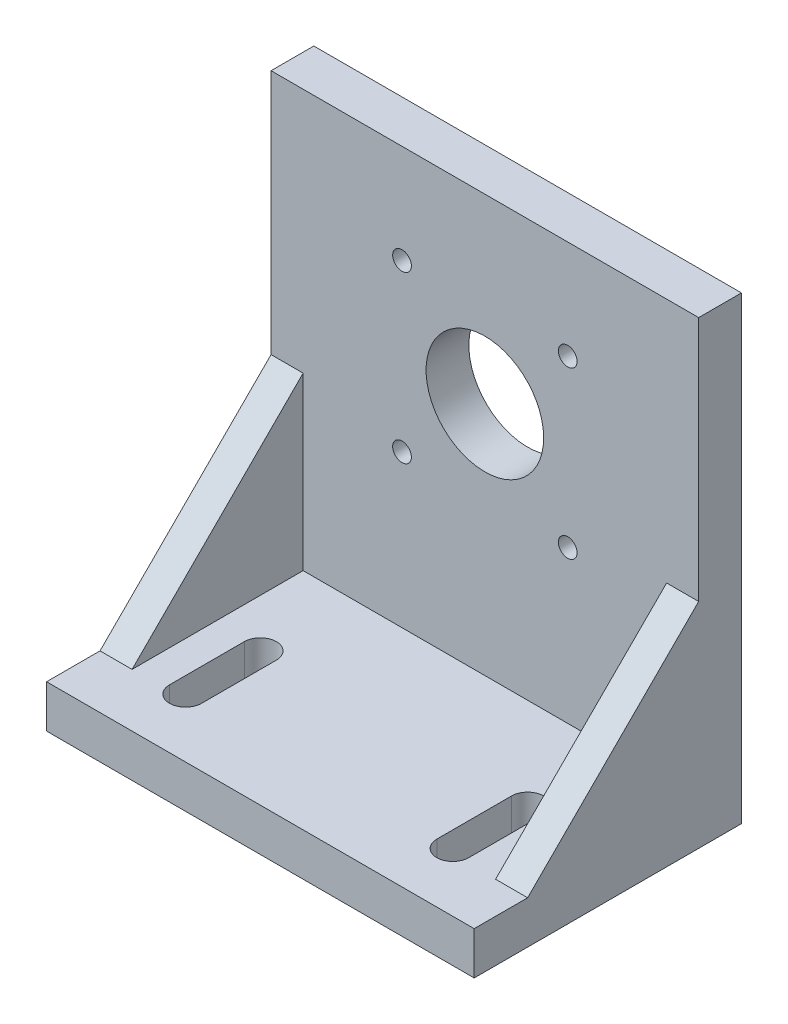
ISO-10303-21;
HEADER;
FILE_DESCRIPTION(('STEP AP214'),'2;1');
FILE_NAME('part.step','',(''),(''),'','','');
FILE_SCHEMA(('AUTOMOTIVE_DESIGN { 1 0 10303 214 1 1 1 1 }'));
ENDSEC;
DATA;
#1=APPLICATION_CONTEXT('core data for automotive mechanical design processes');
#2=APPLICATION_PROTOCOL_DEFINITION('international standard','automotive_design',2000,#1);
#3=PRODUCT_CONTEXT('',#1,'mechanical');
#4=PRODUCT('Part','Part','',(#3));
#5=PRODUCT_RELATED_PRODUCT_CATEGORY('part','',(#4));
#6=PRODUCT_DEFINITION_FORMATION('','',#4);
#7=PRODUCT_DEFINITION_CONTEXT('part definition',#1,'design');
#8=PRODUCT_DEFINITION('design','',#6,#7);
#9=PRODUCT_DEFINITION_SHAPE('','',#8);
#10=(LENGTH_UNIT() NAMED_UNIT(*) SI_UNIT(.MILLI.,.METRE.));
#11=(NAMED_UNIT(*) PLANE_ANGLE_UNIT() SI_UNIT($,.RADIAN.));
#12=(NAMED_UNIT(*) SI_UNIT($,.STERADIAN.) SOLID_ANGLE_UNIT());
#13=UNCERTAINTY_MEASURE_WITH_UNIT(LENGTH_MEASURE(1.E-05),#10,'distance_accuracy_value','');
#14=(GEOMETRIC_REPRESENTATION_CONTEXT(3) GLOBAL_UNCERTAINTY_ASSIGNED_CONTEXT((#13)) GLOBAL_UNIT_ASSIGNED_CONTEXT((#10,
#11,#12)) REPRESENTATION_CONTEXT('',''));
#15=CARTESIAN_POINT('',(0.,0.,0.));
#16=DIRECTION('',(0.,0.,1.));
#17=DIRECTION('',(1.,0.,0.));
#18=AXIS2_PLACEMENT_3D('',#15,#16,#17);
#19=CARTESIAN_POINT('',(0.,8.,0.));
#20=DIRECTION('',(0.,-1.,0.));
#21=DIRECTION('',(0.,0.,-1.));
#22=AXIS2_PLACEMENT_3D('',#19,#20,#21);
#23=PLANE('',#22);
#24=DIRECTION('',(0.,0.,-1.));
#25=VECTOR('',#24,1.);
#26=CARTESIAN_POINT('',(-28.,8.,0.));
#27=LINE('',#26,#25);
#28=CARTESIAN_POINT('',(-28.,8.00000000000001,31.));
#29=VERTEX_POINT('',#28);
#30=CARTESIAN_POINT('',(-28.,8.,17.));
#31=VERTEX_POINT('',#30);
#32=EDGE_CURVE('E281',#29,#31,#27,.T.);
#33=ORIENTED_EDGE('',*,*,#32,.T.);
#34=CARTESIAN_POINT('',(-25.,8.00000000000001,17.));
#35=DIRECTION('',(0.,-1.,0.));
#36=DIRECTION('',(0.,0.,-1.));
#37=AXIS2_PLACEMENT_3D('',#34,#35,#36);
#38=CIRCLE('',#37,3.);
#39=CARTESIAN_POINT('',(-22.,8.00000000000001,17.));
#40=VERTEX_POINT('',#39);
#41=EDGE_CURVE('E252',#31,#40,#38,.T.);
#42=ORIENTED_EDGE('',*,*,#41,.T.);
#43=DIRECTION('',(0.,0.,1.));
#44=VECTOR('',#43,1.);
#45=CARTESIAN_POINT('',(-22.,8.,0.));
#46=LINE('',#45,#44);
#47=CARTESIAN_POINT('',(-22.,8.00000000000001,31.));
#48=VERTEX_POINT('',#47);
#49=EDGE_CURVE('E286',#40,#48,#46,.T.);
#50=ORIENTED_EDGE('',*,*,#49,.T.);
#51=CARTESIAN_POINT('',(-25.,8.00000000000001,31.));
#52=DIRECTION('',(0.,-1.,0.));
#53=DIRECTION('',(0.,0.,-1.));
#54=AXIS2_PLACEMENT_3D('',#51,#52,#53);
#55=CIRCLE('',#54,3.);
#56=EDGE_CURVE('E241',#48,#29,#55,.T.);
#57=ORIENTED_EDGE('',*,*,#56,.T.);
#58=EDGE_LOOP('',(#33,#42,#50,#57));
#59=FACE_BOUND('',#58,.T.);
#60=DIRECTION('',(0.,0.,-1.));
#61=VECTOR('',#60,1.);
#62=CARTESIAN_POINT('',(22.,8.,0.));
#63=LINE('',#62,#61);
#64=CARTESIAN_POINT('',(22.,8.00000000000001,31.));
#65=VERTEX_POINT('',#64);
#66=CARTESIAN_POINT('',(22.,8.,17.));
#67=VERTEX_POINT('',#66);
#68=EDGE_CURVE('E269',#65,#67,#63,.T.);
#69=ORIENTED_EDGE('',*,*,#68,.T.);
#70=CARTESIAN_POINT('',(25.,8.00000000000001,17.));
#71=DIRECTION('',(0.,-1.,0.));
#72=DIRECTION('',(0.,0.,-1.));
#73=AXIS2_PLACEMENT_3D('',#70,#71,#72);
#74=CIRCLE('',#73,3.);
#75=CARTESIAN_POINT('',(28.,8.00000000000001,17.));
#76=VERTEX_POINT('',#75);
#77=EDGE_CURVE('E197',#67,#76,#74,.T.);
#78=ORIENTED_EDGE('',*,*,#77,.T.);
#79=DIRECTION('',(0.,0.,1.));
#80=VECTOR('',#79,1.);
#81=CARTESIAN_POINT('',(28.,8.,0.));
#82=LINE('',#81,#80);
#83=CARTESIAN_POINT('',(28.,8.00000000000001,31.));
#84=VERTEX_POINT('',#83);
#85=EDGE_CURVE('E275',#76,#84,#82,.T.);
#86=ORIENTED_EDGE('',*,*,#85,.T.);
#87=CARTESIAN_POINT('',(25.,8.00000000000001,31.));
#88=DIRECTION('',(0.,-1.,0.));
#89=DIRECTION('',(0.,0.,-1.));
#90=AXIS2_PLACEMENT_3D('',#87,#88,#89);
#91=CIRCLE('',#90,3.);
#92=EDGE_CURVE('E272',#84,#65,#91,.T.);
#93=ORIENTED_EDGE('',*,*,#92,.T.);
#94=EDGE_LOOP('',(#69,#78,#86,#93));
#95=FACE_BOUND('',#94,.T.);
#96=DIRECTION('',(-1.,0.,0.));
#97=VECTOR('',#96,1.);
#98=CARTESIAN_POINT('',(40.,8.,32.));
#99=LINE('',#98,#97);
#100=CARTESIAN_POINT('',(40.,8.,32.));
#101=VERTEX_POINT('',#100);
#102=CARTESIAN_POINT('',(34.,8.,32.));
#103=VERTEX_POINT('',#102);
#104=EDGE_CURVE('E67',#101,#103,#99,.T.);
#105=ORIENTED_EDGE('',*,*,#104,.T.);
#106=DIRECTION('',(0.,0.,-1.));
#107=VECTOR('',#106,1.);
#108=CARTESIAN_POINT('',(34.,8.,0.));
#109=LINE('',#108,#107);
#110=CARTESIAN_POINT('',(34.,8.,0.));
#111=VERTEX_POINT('',#110);
#112=EDGE_CURVE('E463',#103,#111,#109,.T.);
#113=ORIENTED_EDGE('',*,*,#112,.T.);
#114=DIRECTION('',(1.,0.,0.));
#115=VECTOR('',#114,1.);
#116=CARTESIAN_POINT('',(-40.,8.,0.));
#117=LINE('',#116,#115);
#118=CARTESIAN_POINT('',(-34.,8.,0.));
#119=VERTEX_POINT('',#118);
#120=EDGE_CURVE('E305',#119,#111,#117,.T.);
#121=ORIENTED_EDGE('',*,*,#120,.F.);
#122=DIRECTION('',(0.,0.,-1.));
#123=VECTOR('',#122,1.);
#124=CARTESIAN_POINT('',(-34.,8.,0.));
#125=LINE('',#124,#123);
#126=CARTESIAN_POINT('',(-34.,8.,32.));
#127=VERTEX_POINT('',#126);
#128=EDGE_CURVE('E425',#127,#119,#125,.T.);
#129=ORIENTED_EDGE('',*,*,#128,.F.);
#130=DIRECTION('',(-1.,0.,0.));
#131=VECTOR('',#130,1.);
#132=CARTESIAN_POINT('',(-34.,8.,32.));
#133=LINE('',#132,#131);
#134=CARTESIAN_POINT('',(-40.,8.,32.));
#135=VERTEX_POINT('',#134);
#136=EDGE_CURVE('E418',#127,#135,#133,.T.);
#137=ORIENTED_EDGE('',*,*,#136,.T.);
#138=DIRECTION('',(0.,0.,1.));
#139=VECTOR('',#138,1.);
#140=CARTESIAN_POINT('',(-40.,8.,42.));
#141=LINE('',#140,#139);
#142=CARTESIAN_POINT('',(-40.,8.,42.));
#143=VERTEX_POINT('',#142);
#144=EDGE_CURVE('E311',#135,#143,#141,.T.);
#145=ORIENTED_EDGE('',*,*,#144,.T.);
#146=DIRECTION('',(1.,0.,0.));
#147=VECTOR('',#146,1.);
#148=CARTESIAN_POINT('',(40.,8.,42.));
#149=LINE('',#148,#147);
#150=CARTESIAN_POINT('',(40.,8.,42.));
#151=VERTEX_POINT('',#150);
#152=EDGE_CURVE('E314',#143,#151,#149,.T.);
#153=ORIENTED_EDGE('',*,*,#152,.T.);
#154=DIRECTION('',(0.,0.,-1.));
#155=VECTOR('',#154,1.);
#156=CARTESIAN_POINT('',(40.,8.,-8.));
#157=LINE('',#156,#155);
#158=EDGE_CURVE('E318',#151,#101,#157,.T.);
#159=ORIENTED_EDGE('',*,*,#158,.T.);
#160=EDGE_LOOP('',(#105,#113,#121,#129,#137,#145,#153,#159));
#161=FACE_BOUND('',#160,.T.);
#162=ADVANCED_FACE('F51',(#59,#95,#161),#23,.F.);
#163=CARTESIAN_POINT('',(0.,0.,0.));
#164=DIRECTION('',(0.,0.,1.));
#165=DIRECTION('',(1.,0.,0.));
#166=AXIS2_PLACEMENT_3D('',#163,#164,#165);
#167=PLANE('',#166);
#168=CARTESIAN_POINT('',(15.5,67.5,0.));
#169=DIRECTION('',(0.,0.,1.));
#170=DIRECTION('',(1.,0.,0.));
#171=AXIS2_PLACEMENT_3D('',#168,#169,#170);
#172=CIRCLE('',#171,1.75);
#173=CARTESIAN_POINT('',(17.25,67.5,0.));
#174=VERTEX_POINT('',#173);
#175=EDGE_CURVE('E432',#174,#174,#172,.T.);
#176=ORIENTED_EDGE('',*,*,#175,.F.);
#177=EDGE_LOOP('',(#176));
#178=FACE_BOUND('',#177,.T.);
#179=CARTESIAN_POINT('',(-15.5,36.5,0.));
#180=DIRECTION('',(0.,0.,1.));
#181=DIRECTION('',(1.,0.,0.));
#182=AXIS2_PLACEMENT_3D('',#179,#180,#181);
#183=CIRCLE('',#182,1.75);
#184=CARTESIAN_POINT('',(-13.75,36.5,0.));
#185=VERTEX_POINT('',#184);
#186=EDGE_CURVE('E440',#185,#185,#183,.T.);
#187=ORIENTED_EDGE('',*,*,#186,.F.);
#188=EDGE_LOOP('',(#187));
#189=FACE_BOUND('',#188,.T.);
#190=CARTESIAN_POINT('',(15.5,36.5,0.));
#191=DIRECTION('',(0.,0.,1.));
#192=DIRECTION('',(1.,0.,0.));
#193=AXIS2_PLACEMENT_3D('',#190,#191,#192);
#194=CIRCLE('',#193,1.75);
#195=CARTESIAN_POINT('',(17.25,36.5,0.));
#196=VERTEX_POINT('',#195);
#197=EDGE_CURVE('E422',#196,#196,#194,.T.);
#198=ORIENTED_EDGE('',*,*,#197,.F.);
#199=EDGE_LOOP('',(#198));
#200=FACE_BOUND('',#199,.T.);
#201=CARTESIAN_POINT('',(-15.5,67.5,0.));
#202=DIRECTION('',(0.,0.,1.));
#203=DIRECTION('',(1.,0.,0.));
#204=AXIS2_PLACEMENT_3D('',#201,#202,#203);
#205=CIRCLE('',#204,1.75);
#206=CARTESIAN_POINT('',(-13.75,67.5,0.));
#207=VERTEX_POINT('',#206);
#208=EDGE_CURVE('E436',#207,#207,#205,.T.);
#209=ORIENTED_EDGE('',*,*,#208,.F.);
#210=EDGE_LOOP('',(#209));
#211=FACE_BOUND('',#210,.T.);
#212=CARTESIAN_POINT('',(0.,52.,0.));
#213=DIRECTION('',(0.,0.,1.));
#214=DIRECTION('',(1.,0.,0.));
#215=AXIS2_PLACEMENT_3D('',#212,#213,#214);
#216=CIRCLE('',#215,11.);
#217=CARTESIAN_POINT('',(11.,52.,0.));
#218=VERTEX_POINT('',#217);
#219=EDGE_CURVE('E451',#218,#218,#216,.T.);
#220=ORIENTED_EDGE('',*,*,#219,.F.);
#221=EDGE_LOOP('',(#220));
#222=FACE_BOUND('',#221,.T.);
#223=DIRECTION('',(0.,1.,0.));
#224=VECTOR('',#223,1.);
#225=CARTESIAN_POINT('',(34.,40.,0.));
#226=LINE('',#225,#224);
#227=CARTESIAN_POINT('',(34.,40.,0.));
#228=VERTEX_POINT('',#227);
#229=EDGE_CURVE('E75',#111,#228,#226,.T.);
#230=ORIENTED_EDGE('',*,*,#229,.T.);
#231=DIRECTION('',(-1.,0.,0.));
#232=VECTOR('',#231,1.);
#233=CARTESIAN_POINT('',(40.,40.,0.));
#234=LINE('',#233,#232);
#235=CARTESIAN_POINT('',(40.,40.,0.));
#236=VERTEX_POINT('',#235);
#237=EDGE_CURVE('E408',#236,#228,#234,.T.);
#238=ORIENTED_EDGE('',*,*,#237,.F.);
#239=DIRECTION('',(0.,1.,0.));
#240=VECTOR('',#239,1.);
#241=CARTESIAN_POINT('',(40.,8.,0.));
#242=LINE('',#241,#240);
#243=CARTESIAN_POINT('',(40.,86.,0.));
#244=VERTEX_POINT('',#243);
#245=EDGE_CURVE('E307',#236,#244,#242,.T.);
#246=ORIENTED_EDGE('',*,*,#245,.T.);
#247=DIRECTION('',(1.,0.,0.));
#248=VECTOR('',#247,1.);
#249=CARTESIAN_POINT('',(0.,86.,0.));
#250=LINE('',#249,#248);
#251=CARTESIAN_POINT('',(-40.,86.,0.));
#252=VERTEX_POINT('',#251);
#253=EDGE_CURVE('E189',#252,#244,#250,.T.);
#254=ORIENTED_EDGE('',*,*,#253,.F.);
#255=DIRECTION('',(0.,-1.,0.));
#256=VECTOR('',#255,1.);
#257=CARTESIAN_POINT('',(-40.,94.,0.));
#258=LINE('',#257,#256);
#259=CARTESIAN_POINT('',(-40.,40.,0.));
#260=VERTEX_POINT('',#259);
#261=EDGE_CURVE('E302',#252,#260,#258,.T.);
#262=ORIENTED_EDGE('',*,*,#261,.T.);
#263=DIRECTION('',(-1.,0.,0.));
#264=VECTOR('',#263,1.);
#265=CARTESIAN_POINT('',(-34.,40.,0.));
#266=LINE('',#265,#264);
#267=CARTESIAN_POINT('',(-34.,40.,0.));
#268=VERTEX_POINT('',#267);
#269=EDGE_CURVE('E411',#268,#260,#266,.T.);
#270=ORIENTED_EDGE('',*,*,#269,.F.);
#271=DIRECTION('',(0.,1.,0.));
#272=VECTOR('',#271,1.);
#273=CARTESIAN_POINT('',(-34.,40.,0.));
#274=LINE('',#273,#272);
#275=EDGE_CURVE('E407',#119,#268,#274,.T.);
#276=ORIENTED_EDGE('',*,*,#275,.F.);
#277=ORIENTED_EDGE('',*,*,#120,.T.);
#278=EDGE_LOOP('',(#230,#238,#246,#254,#262,#270,#276,#277));
#279=FACE_BOUND('',#278,.T.);
#280=ADVANCED_FACE('F358',(#178,#189,#200,#211,#222,#279),#167,.T.);
#281=CARTESIAN_POINT('',(-40.,8.,42.));
#282=DIRECTION('',(1.,0.,0.));
#283=DIRECTION('',(0.,0.,-1.));
#284=AXIS2_PLACEMENT_3D('',#281,#282,#283);
#285=PLANE('',#284);
#286=ORIENTED_EDGE('',*,*,#144,.F.);
#287=DIRECTION('',(0.,-0.707106781186548,0.707106781186548));
#288=VECTOR('',#287,1.);
#289=CARTESIAN_POINT('',(-40.,8.,32.));
#290=LINE('',#289,#288);
#291=EDGE_CURVE('E402',#260,#135,#290,.T.);
#292=ORIENTED_EDGE('',*,*,#291,.F.);
#293=ORIENTED_EDGE('',*,*,#261,.F.);
#294=DIRECTION('',(0.,0.,-1.));
#295=VECTOR('',#294,1.);
#296=CARTESIAN_POINT('',(-40.,86.,42.));
#297=LINE('',#296,#295);
#298=CARTESIAN_POINT('',(-40.,86.,-8.));
#299=VERTEX_POINT('',#298);
#300=EDGE_CURVE('E294',#252,#299,#297,.T.);
#301=ORIENTED_EDGE('',*,*,#300,.T.);
#302=DIRECTION('',(0.,-1.,0.));
#303=VECTOR('',#302,1.);
#304=CARTESIAN_POINT('',(-40.,8.,-8.));
#305=LINE('',#304,#303);
#306=CARTESIAN_POINT('',(-40.,0.,-8.));
#307=VERTEX_POINT('',#306);
#308=EDGE_CURVE('E321',#299,#307,#305,.T.);
#309=ORIENTED_EDGE('',*,*,#308,.T.);
#310=DIRECTION('',(0.,0.,1.));
#311=VECTOR('',#310,1.);
#312=CARTESIAN_POINT('',(-40.,0.,42.));
#313=LINE('',#312,#311);
#314=CARTESIAN_POINT('',(-40.,0.,42.));
#315=VERTEX_POINT('',#314);
#316=EDGE_CURVE('E310',#307,#315,#313,.T.);
#317=ORIENTED_EDGE('',*,*,#316,.T.);
#318=DIRECTION('',(0.,-1.,0.));
#319=VECTOR('',#318,1.);
#320=CARTESIAN_POINT('',(-40.,8.,42.));
#321=LINE('',#320,#319);
#322=EDGE_CURVE('E344',#143,#315,#321,.T.);
#323=ORIENTED_EDGE('',*,*,#322,.F.);
#324=EDGE_LOOP('',(#286,#292,#293,#301,#309,#317,#323));
#325=FACE_BOUND('',#324,.T.);
#326=ADVANCED_FACE('F53',(#325),#285,.F.);
#327=CARTESIAN_POINT('',(40.,8.,42.));
#328=DIRECTION('',(0.,0.,-1.));
#329=DIRECTION('',(-1.,0.,0.));
#330=AXIS2_PLACEMENT_3D('',#327,#328,#329);
#331=PLANE('',#330);
#332=DIRECTION('',(1.,0.,0.));
#333=VECTOR('',#332,1.);
#334=CARTESIAN_POINT('',(40.,0.,42.));
#335=LINE('',#334,#333);
#336=CARTESIAN_POINT('',(40.,0.,42.));
#337=VERTEX_POINT('',#336);
#338=EDGE_CURVE('E325',#315,#337,#335,.T.);
#339=ORIENTED_EDGE('',*,*,#338,.T.);
#340=DIRECTION('',(0.,-1.,0.));
#341=VECTOR('',#340,1.);
#342=CARTESIAN_POINT('',(40.,8.,42.));
#343=LINE('',#342,#341);
#344=EDGE_CURVE('E340',#151,#337,#343,.T.);
#345=ORIENTED_EDGE('',*,*,#344,.F.);
#346=ORIENTED_EDGE('',*,*,#152,.F.);
#347=ORIENTED_EDGE('',*,*,#322,.T.);
#348=EDGE_LOOP('',(#339,#345,#346,#347));
#349=FACE_BOUND('',#348,.T.);
#350=ADVANCED_FACE('F376',(#349),#331,.F.);
#351=CARTESIAN_POINT('',(40.,8.,-8.));
#352=DIRECTION('',(-1.,0.,0.));
#353=DIRECTION('',(0.,0.,1.));
#354=AXIS2_PLACEMENT_3D('',#351,#352,#353);
#355=PLANE('',#354);
#356=ORIENTED_EDGE('',*,*,#245,.F.);
#357=DIRECTION('',(0.,-0.707106781186548,0.707106781186548));
#358=VECTOR('',#357,1.);
#359=CARTESIAN_POINT('',(40.,8.,32.));
#360=LINE('',#359,#358);
#361=EDGE_CURVE('E464',#236,#101,#360,.T.);
#362=ORIENTED_EDGE('',*,*,#361,.T.);
#363=ORIENTED_EDGE('',*,*,#158,.F.);
#364=ORIENTED_EDGE('',*,*,#344,.T.);
#365=DIRECTION('',(0.,0.,-1.));
#366=VECTOR('',#365,1.);
#367=CARTESIAN_POINT('',(40.,0.,-8.));
#368=LINE('',#367,#366);
#369=CARTESIAN_POINT('',(40.,0.,-8.));
#370=VERTEX_POINT('',#369);
#371=EDGE_CURVE('E328',#337,#370,#368,.T.);
#372=ORIENTED_EDGE('',*,*,#371,.T.);
#373=DIRECTION('',(0.,-1.,0.));
#374=VECTOR('',#373,1.);
#375=CARTESIAN_POINT('',(40.,8.,-8.));
#376=LINE('',#375,#374);
#377=CARTESIAN_POINT('',(40.,86.,-8.));
#378=VERTEX_POINT('',#377);
#379=EDGE_CURVE('E337',#378,#370,#376,.T.);
#380=ORIENTED_EDGE('',*,*,#379,.F.);
#381=DIRECTION('',(0.,0.,1.));
#382=VECTOR('',#381,1.);
#383=CARTESIAN_POINT('',(40.,86.,-8.));
#384=LINE('',#383,#382);
#385=EDGE_CURVE('E291',#378,#244,#384,.T.);
#386=ORIENTED_EDGE('',*,*,#385,.T.);
#387=EDGE_LOOP('',(#356,#362,#363,#364,#372,#380,#386));
#388=FACE_BOUND('',#387,.T.);
#389=ADVANCED_FACE('F373',(#388),#355,.F.);
#390=CARTESIAN_POINT('',(-40.,8.,-8.));
#391=DIRECTION('',(0.,0.,1.));
#392=DIRECTION('',(1.,0.,0.));
#393=AXIS2_PLACEMENT_3D('',#390,#391,#392);
#394=PLANE('',#393);
#395=CARTESIAN_POINT('',(15.5,67.5,-8.));
#396=DIRECTION('',(0.,0.,1.));
#397=DIRECTION('',(1.,0.,0.));
#398=AXIS2_PLACEMENT_3D('',#395,#396,#397);
#399=CIRCLE('',#398,1.75);
#400=CARTESIAN_POINT('',(17.25,67.5,-8.));
#401=VERTEX_POINT('',#400);
#402=EDGE_CURVE('E437',#401,#401,#399,.T.);
#403=ORIENTED_EDGE('',*,*,#402,.T.);
#404=EDGE_LOOP('',(#403));
#405=FACE_BOUND('',#404,.T.);
#406=CARTESIAN_POINT('',(-15.5,36.5,-8.));
#407=DIRECTION('',(0.,0.,1.));
#408=DIRECTION('',(1.,0.,0.));
#409=AXIS2_PLACEMENT_3D('',#406,#407,#408);
#410=CIRCLE('',#409,1.75);
#411=CARTESIAN_POINT('',(-13.75,36.5,-8.));
#412=VERTEX_POINT('',#411);
#413=EDGE_CURVE('E430',#412,#412,#410,.T.);
#414=ORIENTED_EDGE('',*,*,#413,.T.);
#415=EDGE_LOOP('',(#414));
#416=FACE_BOUND('',#415,.T.);
#417=CARTESIAN_POINT('',(15.5,36.5,-8.));
#418=DIRECTION('',(0.,0.,1.));
#419=DIRECTION('',(1.,0.,0.));
#420=AXIS2_PLACEMENT_3D('',#417,#418,#419);
#421=CIRCLE('',#420,1.75);
#422=CARTESIAN_POINT('',(17.25,36.5,-8.));
#423=VERTEX_POINT('',#422);
#424=EDGE_CURVE('E417',#423,#423,#421,.T.);
#425=ORIENTED_EDGE('',*,*,#424,.T.);
#426=EDGE_LOOP('',(#425));
#427=FACE_BOUND('',#426,.T.);
#428=CARTESIAN_POINT('',(-15.5,67.5,-8.));
#429=DIRECTION('',(0.,0.,1.));
#430=DIRECTION('',(1.,0.,0.));
#431=AXIS2_PLACEMENT_3D('',#428,#429,#430);
#432=CIRCLE('',#431,1.75);
#433=CARTESIAN_POINT('',(-13.75,67.5,-8.));
#434=VERTEX_POINT('',#433);
#435=EDGE_CURVE('E447',#434,#434,#432,.T.);
#436=ORIENTED_EDGE('',*,*,#435,.T.);
#437=EDGE_LOOP('',(#436));
#438=FACE_BOUND('',#437,.T.);
#439=CARTESIAN_POINT('',(0.,52.,-8.));
#440=DIRECTION('',(0.,0.,1.));
#441=DIRECTION('',(1.,0.,0.));
#442=AXIS2_PLACEMENT_3D('',#439,#440,#441);
#443=CIRCLE('',#442,11.);
#444=CARTESIAN_POINT('',(11.,52.,-8.));
#445=VERTEX_POINT('',#444);
#446=EDGE_CURVE('E268',#445,#445,#443,.T.);
#447=ORIENTED_EDGE('',*,*,#446,.T.);
#448=EDGE_LOOP('',(#447));
#449=FACE_BOUND('',#448,.T.);
#450=ORIENTED_EDGE('',*,*,#308,.F.);
#451=DIRECTION('',(1.,0.,0.));
#452=VECTOR('',#451,1.);
#453=CARTESIAN_POINT('',(-40.,86.,-8.));
#454=LINE('',#453,#452);
#455=EDGE_CURVE('E298',#299,#378,#454,.T.);
#456=ORIENTED_EDGE('',*,*,#455,.T.);
#457=ORIENTED_EDGE('',*,*,#379,.T.);
#458=DIRECTION('',(-1.,0.,0.));
#459=VECTOR('',#458,1.);
#460=CARTESIAN_POINT('',(-40.,0.,-8.));
#461=LINE('',#460,#459);
#462=EDGE_CURVE('E315',#370,#307,#461,.T.);
#463=ORIENTED_EDGE('',*,*,#462,.T.);
#464=EDGE_LOOP('',(#450,#456,#457,#463));
#465=FACE_BOUND('',#464,.T.);
#466=ADVANCED_FACE('F370',(#405,#416,#427,#438,#449,#465),#394,.F.);
#467=CARTESIAN_POINT('',(0.,0.,0.));
#468=DIRECTION('',(0.,-1.,0.));
#469=DIRECTION('',(0.,0.,-1.));
#470=AXIS2_PLACEMENT_3D('',#467,#468,#469);
#471=PLANE('',#470);
#472=CARTESIAN_POINT('',(-25.,0.,17.));
#473=DIRECTION('',(0.,-1.,0.));
#474=DIRECTION('',(0.,0.,-1.));
#475=AXIS2_PLACEMENT_3D('',#472,#473,#474);
#476=CIRCLE('',#475,3.);
#477=CARTESIAN_POINT('',(-28.,0.,17.));
#478=VERTEX_POINT('',#477);
#479=CARTESIAN_POINT('',(-22.,0.,17.));
#480=VERTEX_POINT('',#479);
#481=EDGE_CURVE('E11',#478,#480,#476,.T.);
#482=ORIENTED_EDGE('',*,*,#481,.F.);
#483=DIRECTION('',(0.,0.,-1.));
#484=VECTOR('',#483,1.);
#485=CARTESIAN_POINT('',(-28.,0.,0.));
#486=LINE('',#485,#484);
#487=CARTESIAN_POINT('',(-28.,0.,31.));
#488=VERTEX_POINT('',#487);
#489=EDGE_CURVE('E207',#488,#478,#486,.T.);
#490=ORIENTED_EDGE('',*,*,#489,.F.);
#491=CARTESIAN_POINT('',(-25.,0.,31.));
#492=DIRECTION('',(0.,-1.,0.));
#493=DIRECTION('',(0.,0.,-1.));
#494=AXIS2_PLACEMENT_3D('',#491,#492,#493);
#495=CIRCLE('',#494,3.);
#496=CARTESIAN_POINT('',(-22.,0.,31.));
#497=VERTEX_POINT('',#496);
#498=EDGE_CURVE('E212',#497,#488,#495,.T.);
#499=ORIENTED_EDGE('',*,*,#498,.F.);
#500=DIRECTION('',(0.,0.,1.));
#501=VECTOR('',#500,1.);
#502=CARTESIAN_POINT('',(-22.,0.,0.));
#503=LINE('',#502,#501);
#504=EDGE_CURVE('E60',#480,#497,#503,.T.);
#505=ORIENTED_EDGE('',*,*,#504,.F.);
#506=EDGE_LOOP('',(#482,#490,#499,#505));
#507=FACE_BOUND('',#506,.T.);
#508=CARTESIAN_POINT('',(25.,0.,17.));
#509=DIRECTION('',(0.,-1.,0.));
#510=DIRECTION('',(0.,0.,-1.));
#511=AXIS2_PLACEMENT_3D('',#508,#509,#510);
#512=CIRCLE('',#511,3.);
#513=CARTESIAN_POINT('',(22.,0.,17.));
#514=VERTEX_POINT('',#513);
#515=CARTESIAN_POINT('',(28.,0.,17.));
#516=VERTEX_POINT('',#515);
#517=EDGE_CURVE('E194',#514,#516,#512,.T.);
#518=ORIENTED_EDGE('',*,*,#517,.F.);
#519=DIRECTION('',(0.,0.,-1.));
#520=VECTOR('',#519,1.);
#521=CARTESIAN_POINT('',(22.,0.,0.));
#522=LINE('',#521,#520);
#523=CARTESIAN_POINT('',(22.,0.,31.));
#524=VERTEX_POINT('',#523);
#525=EDGE_CURVE('E176',#524,#514,#522,.T.);
#526=ORIENTED_EDGE('',*,*,#525,.F.);
#527=CARTESIAN_POINT('',(25.,0.,31.));
#528=DIRECTION('',(0.,-1.,0.));
#529=DIRECTION('',(0.,0.,-1.));
#530=AXIS2_PLACEMENT_3D('',#527,#528,#529);
#531=CIRCLE('',#530,3.);
#532=CARTESIAN_POINT('',(28.,0.,31.));
#533=VERTEX_POINT('',#532);
#534=EDGE_CURVE('E188',#533,#524,#531,.T.);
#535=ORIENTED_EDGE('',*,*,#534,.F.);
#536=DIRECTION('',(0.,0.,1.));
#537=VECTOR('',#536,1.);
#538=CARTESIAN_POINT('',(28.,0.,0.));
#539=LINE('',#538,#537);
#540=EDGE_CURVE('E205',#516,#533,#539,.T.);
#541=ORIENTED_EDGE('',*,*,#540,.F.);
#542=EDGE_LOOP('',(#518,#526,#535,#541));
#543=FACE_BOUND('',#542,.T.);
#544=ORIENTED_EDGE('',*,*,#316,.F.);
#545=ORIENTED_EDGE('',*,*,#462,.F.);
#546=ORIENTED_EDGE('',*,*,#371,.F.);
#547=ORIENTED_EDGE('',*,*,#338,.F.);
#548=EDGE_LOOP('',(#544,#545,#546,#547));
#549=FACE_BOUND('',#548,.T.);
#550=ADVANCED_FACE('F203',(#507,#543,#549),#471,.T.);
#551=CARTESIAN_POINT('',(-50.,86.,-95.));
#552=DIRECTION('',(0.,-1.,0.));
#553=DIRECTION('',(0.,0.,-1.));
#554=AXIS2_PLACEMENT_3D('',#551,#552,#553);
#555=PLANE('',#554);
#556=ORIENTED_EDGE('',*,*,#300,.F.);
#557=ORIENTED_EDGE('',*,*,#253,.T.);
#558=ORIENTED_EDGE('',*,*,#385,.F.);
#559=ORIENTED_EDGE('',*,*,#455,.F.);
#560=EDGE_LOOP('',(#556,#557,#558,#559));
#561=FACE_BOUND('',#560,.T.);
#562=ADVANCED_FACE('F369',(#561),#555,.F.);
#563=CARTESIAN_POINT('',(25.,-79.,17.));
#564=DIRECTION('',(0.,1.,0.));
#565=DIRECTION('',(0.,0.,1.));
#566=AXIS2_PLACEMENT_3D('',#563,#564,#565);
#567=CYLINDRICAL_SURFACE('',#566,3.);
#568=DIRECTION('',(0.,1.,0.));
#569=VECTOR('',#568,1.);
#570=CARTESIAN_POINT('',(22.,-79.,17.));
#571=LINE('',#570,#569);
#572=EDGE_CURVE('E179',#514,#67,#571,.T.);
#573=ORIENTED_EDGE('',*,*,#572,.F.);
#574=ORIENTED_EDGE('',*,*,#517,.T.);
#575=DIRECTION('',(0.,1.,0.));
#576=VECTOR('',#575,1.);
#577=CARTESIAN_POINT('',(28.,-79.,17.));
#578=LINE('',#577,#576);
#579=EDGE_CURVE('E265',#516,#76,#578,.T.);
#580=ORIENTED_EDGE('',*,*,#579,.T.);
#581=ORIENTED_EDGE('',*,*,#77,.F.);
#582=EDGE_LOOP('',(#573,#574,#580,#581));
#583=FACE_BOUND('',#582,.T.);
#584=ADVANCED_FACE('F192',(#583),#567,.F.);
#585=CARTESIAN_POINT('',(28.,-79.,17.));
#586=DIRECTION('',(1.,0.,0.));
#587=DIRECTION('',(0.,0.,-1.));
#588=AXIS2_PLACEMENT_3D('',#585,#586,#587);
#589=PLANE('',#588);
#590=ORIENTED_EDGE('',*,*,#579,.F.);
#591=ORIENTED_EDGE('',*,*,#540,.T.);
#592=DIRECTION('',(0.,1.,0.));
#593=VECTOR('',#592,1.);
#594=CARTESIAN_POINT('',(28.,-79.,31.));
#595=LINE('',#594,#593);
#596=EDGE_CURVE('E262',#533,#84,#595,.T.);
#597=ORIENTED_EDGE('',*,*,#596,.T.);
#598=ORIENTED_EDGE('',*,*,#85,.F.);
#599=EDGE_LOOP('',(#590,#591,#597,#598));
#600=FACE_BOUND('',#599,.T.);
#601=ADVANCED_FACE('F355',(#600),#589,.F.);
#602=CARTESIAN_POINT('',(25.,-79.,31.));
#603=DIRECTION('',(0.,1.,0.));
#604=DIRECTION('',(0.,0.,1.));
#605=AXIS2_PLACEMENT_3D('',#602,#603,#604);
#606=CYLINDRICAL_SURFACE('',#605,3.);
#607=ORIENTED_EDGE('',*,*,#596,.F.);
#608=ORIENTED_EDGE('',*,*,#534,.T.);
#609=DIRECTION('',(0.,1.,0.));
#610=VECTOR('',#609,1.);
#611=CARTESIAN_POINT('',(22.,-79.,31.));
#612=LINE('',#611,#610);
#613=EDGE_CURVE('E182',#524,#65,#612,.T.);
#614=ORIENTED_EDGE('',*,*,#613,.T.);
#615=ORIENTED_EDGE('',*,*,#92,.F.);
#616=EDGE_LOOP('',(#607,#608,#614,#615));
#617=FACE_BOUND('',#616,.T.);
#618=ADVANCED_FACE('F353',(#617),#606,.F.);
#619=CARTESIAN_POINT('',(22.,-79.,31.));
#620=DIRECTION('',(-1.,0.,0.));
#621=DIRECTION('',(0.,0.,1.));
#622=AXIS2_PLACEMENT_3D('',#619,#620,#621);
#623=PLANE('',#622);
#624=ORIENTED_EDGE('',*,*,#613,.F.);
#625=ORIENTED_EDGE('',*,*,#525,.T.);
#626=ORIENTED_EDGE('',*,*,#572,.T.);
#627=ORIENTED_EDGE('',*,*,#68,.F.);
#628=EDGE_LOOP('',(#624,#625,#626,#627));
#629=FACE_BOUND('',#628,.T.);
#630=ADVANCED_FACE('F178',(#629),#623,.F.);
#631=CARTESIAN_POINT('',(-25.,-79.,17.));
#632=DIRECTION('',(0.,1.,0.));
#633=DIRECTION('',(0.,0.,1.));
#634=AXIS2_PLACEMENT_3D('',#631,#632,#633);
#635=CYLINDRICAL_SURFACE('',#634,3.);
#636=DIRECTION('',(0.,1.,0.));
#637=VECTOR('',#636,1.);
#638=CARTESIAN_POINT('',(-28.,-79.,17.));
#639=LINE('',#638,#637);
#640=EDGE_CURVE('E200',#478,#31,#639,.T.);
#641=ORIENTED_EDGE('',*,*,#640,.F.);
#642=ORIENTED_EDGE('',*,*,#481,.T.);
#643=DIRECTION('',(0.,1.,0.));
#644=VECTOR('',#643,1.);
#645=CARTESIAN_POINT('',(-22.,-79.,17.));
#646=LINE('',#645,#644);
#647=EDGE_CURVE('E232',#480,#40,#646,.T.);
#648=ORIENTED_EDGE('',*,*,#647,.T.);
#649=ORIENTED_EDGE('',*,*,#41,.F.);
#650=EDGE_LOOP('',(#641,#642,#648,#649));
#651=FACE_BOUND('',#650,.T.);
#652=ADVANCED_FACE('F250',(#651),#635,.F.);
#653=CARTESIAN_POINT('',(-22.,-79.,17.));
#654=DIRECTION('',(1.,0.,0.));
#655=DIRECTION('',(0.,0.,-1.));
#656=AXIS2_PLACEMENT_3D('',#653,#654,#655);
#657=PLANE('',#656);
#658=ORIENTED_EDGE('',*,*,#647,.F.);
#659=ORIENTED_EDGE('',*,*,#504,.T.);
#660=DIRECTION('',(0.,1.,0.));
#661=VECTOR('',#660,1.);
#662=CARTESIAN_POINT('',(-22.,-79.,31.));
#663=LINE('',#662,#661);
#664=EDGE_CURVE('E229',#497,#48,#663,.T.);
#665=ORIENTED_EDGE('',*,*,#664,.T.);
#666=ORIENTED_EDGE('',*,*,#49,.F.);
#667=EDGE_LOOP('',(#658,#659,#665,#666));
#668=FACE_BOUND('',#667,.T.);
#669=ADVANCED_FACE('F228',(#668),#657,.F.);
#670=CARTESIAN_POINT('',(-25.,-79.,31.));
#671=DIRECTION('',(0.,1.,0.));
#672=DIRECTION('',(0.,0.,1.));
#673=AXIS2_PLACEMENT_3D('',#670,#671,#672);
#674=CYLINDRICAL_SURFACE('',#673,3.);
#675=ORIENTED_EDGE('',*,*,#664,.F.);
#676=ORIENTED_EDGE('',*,*,#498,.T.);
#677=DIRECTION('',(0.,1.,0.));
#678=VECTOR('',#677,1.);
#679=CARTESIAN_POINT('',(-28.,-79.,31.));
#680=LINE('',#679,#678);
#681=EDGE_CURVE('E243',#488,#29,#680,.T.);
#682=ORIENTED_EDGE('',*,*,#681,.T.);
#683=ORIENTED_EDGE('',*,*,#56,.F.);
#684=EDGE_LOOP('',(#675,#676,#682,#683));
#685=FACE_BOUND('',#684,.T.);
#686=ADVANCED_FACE('F237',(#685),#674,.F.);
#687=CARTESIAN_POINT('',(-28.,-79.,31.));
#688=DIRECTION('',(-1.,0.,0.));
#689=DIRECTION('',(0.,0.,1.));
#690=AXIS2_PLACEMENT_3D('',#687,#688,#689);
#691=PLANE('',#690);
#692=ORIENTED_EDGE('',*,*,#681,.F.);
#693=ORIENTED_EDGE('',*,*,#489,.T.);
#694=ORIENTED_EDGE('',*,*,#640,.T.);
#695=ORIENTED_EDGE('',*,*,#32,.F.);
#696=EDGE_LOOP('',(#692,#693,#694,#695));
#697=FACE_BOUND('',#696,.T.);
#698=ADVANCED_FACE('F247',(#697),#691,.F.);
#699=CARTESIAN_POINT('',(0.,52.,-8.));
#700=DIRECTION('',(0.,0.,1.));
#701=DIRECTION('',(1.,0.,0.));
#702=AXIS2_PLACEMENT_3D('',#699,#700,#701);
#703=CYLINDRICAL_SURFACE('',#702,11.);
#704=ORIENTED_EDGE('',*,*,#446,.F.);
#705=EDGE_LOOP('',(#704));
#706=FACE_BOUND('',#705,.T.);
#707=ORIENTED_EDGE('',*,*,#219,.T.);
#708=EDGE_LOOP('',(#707));
#709=FACE_BOUND('',#708,.T.);
#710=ADVANCED_FACE('F524',(#706,#709),#703,.F.);
#711=CARTESIAN_POINT('',(-15.5,67.5,-8.));
#712=DIRECTION('',(0.,0.,1.));
#713=DIRECTION('',(1.,0.,0.));
#714=AXIS2_PLACEMENT_3D('',#711,#712,#713);
#715=CYLINDRICAL_SURFACE('',#714,1.75);
#716=ORIENTED_EDGE('',*,*,#435,.F.);
#717=EDGE_LOOP('',(#716));
#718=FACE_BOUND('',#717,.T.);
#719=ORIENTED_EDGE('',*,*,#208,.T.);
#720=EDGE_LOOP('',(#719));
#721=FACE_BOUND('',#720,.T.);
#722=ADVANCED_FACE('F513',(#718,#721),#715,.F.);
#723=CARTESIAN_POINT('',(15.5,36.5,-8.));
#724=DIRECTION('',(0.,0.,1.));
#725=DIRECTION('',(1.,0.,0.));
#726=AXIS2_PLACEMENT_3D('',#723,#724,#725);
#727=CYLINDRICAL_SURFACE('',#726,1.75);
#728=ORIENTED_EDGE('',*,*,#424,.F.);
#729=EDGE_LOOP('',(#728));
#730=FACE_BOUND('',#729,.T.);
#731=ORIENTED_EDGE('',*,*,#197,.T.);
#732=EDGE_LOOP('',(#731));
#733=FACE_BOUND('',#732,.T.);
#734=ADVANCED_FACE('F509',(#730,#733),#727,.F.);
#735=CARTESIAN_POINT('',(-15.5,36.5,-8.));
#736=DIRECTION('',(0.,0.,1.));
#737=DIRECTION('',(1.,0.,0.));
#738=AXIS2_PLACEMENT_3D('',#735,#736,#737);
#739=CYLINDRICAL_SURFACE('',#738,1.75);
#740=ORIENTED_EDGE('',*,*,#413,.F.);
#741=EDGE_LOOP('',(#740));
#742=FACE_BOUND('',#741,.T.);
#743=ORIENTED_EDGE('',*,*,#186,.T.);
#744=EDGE_LOOP('',(#743));
#745=FACE_BOUND('',#744,.T.);
#746=ADVANCED_FACE('F512',(#742,#745),#739,.F.);
#747=CARTESIAN_POINT('',(15.5,67.5,-8.));
#748=DIRECTION('',(0.,0.,1.));
#749=DIRECTION('',(1.,0.,0.));
#750=AXIS2_PLACEMENT_3D('',#747,#748,#749);
#751=CYLINDRICAL_SURFACE('',#750,1.75);
#752=ORIENTED_EDGE('',*,*,#402,.F.);
#753=EDGE_LOOP('',(#752));
#754=FACE_BOUND('',#753,.T.);
#755=ORIENTED_EDGE('',*,*,#175,.T.);
#756=EDGE_LOOP('',(#755));
#757=FACE_BOUND('',#756,.T.);
#758=ADVANCED_FACE('F508',(#754,#757),#751,.F.);
#759=CARTESIAN_POINT('',(-34.,8.,32.));
#760=DIRECTION('',(0.,-0.707106781186547,-0.707106781186547));
#761=DIRECTION('',(0.,0.707106781186548,-0.707106781186548));
#762=AXIS2_PLACEMENT_3D('',#759,#760,#761);
#763=PLANE('',#762);
#764=ORIENTED_EDGE('',*,*,#291,.T.);
#765=ORIENTED_EDGE('',*,*,#136,.F.);
#766=DIRECTION('',(0.,-0.707106781186548,0.707106781186548));
#767=VECTOR('',#766,1.);
#768=CARTESIAN_POINT('',(-34.,8.,32.));
#769=LINE('',#768,#767);
#770=EDGE_CURVE('E414',#268,#127,#769,.T.);
#771=ORIENTED_EDGE('',*,*,#770,.F.);
#772=ORIENTED_EDGE('',*,*,#269,.T.);
#773=EDGE_LOOP('',(#764,#765,#771,#772));
#774=FACE_BOUND('',#773,.T.);
#775=ADVANCED_FACE('F412',(#774),#763,.F.);
#776=CARTESIAN_POINT('',(-34.,0.,0.));
#777=DIRECTION('',(-1.,0.,0.));
#778=DIRECTION('',(0.,0.,1.));
#779=AXIS2_PLACEMENT_3D('',#776,#777,#778);
#780=PLANE('',#779);
#781=ORIENTED_EDGE('',*,*,#275,.T.);
#782=ORIENTED_EDGE('',*,*,#770,.T.);
#783=ORIENTED_EDGE('',*,*,#128,.T.);
#784=EDGE_LOOP('',(#781,#782,#783));
#785=FACE_BOUND('',#784,.T.);
#786=ADVANCED_FACE('F486',(#785),#780,.F.);
#787=CARTESIAN_POINT('',(40.,8.,32.));
#788=DIRECTION('',(0.,-0.707106781186547,-0.707106781186547));
#789=DIRECTION('',(0.,0.707106781186548,-0.707106781186548));
#790=AXIS2_PLACEMENT_3D('',#787,#788,#789);
#791=PLANE('',#790);
#792=DIRECTION('',(0.,-0.707106781186548,0.707106781186548));
#793=VECTOR('',#792,1.);
#794=CARTESIAN_POINT('',(34.,8.,32.));
#795=LINE('',#794,#793);
#796=EDGE_CURVE('E465',#228,#103,#795,.T.);
#797=ORIENTED_EDGE('',*,*,#796,.T.);
#798=ORIENTED_EDGE('',*,*,#104,.F.);
#799=ORIENTED_EDGE('',*,*,#361,.F.);
#800=ORIENTED_EDGE('',*,*,#237,.T.);
#801=EDGE_LOOP('',(#797,#798,#799,#800));
#802=FACE_BOUND('',#801,.T.);
#803=ADVANCED_FACE('F492',(#802),#791,.F.);
#804=CARTESIAN_POINT('',(34.,0.,0.));
#805=DIRECTION('',(-1.,0.,0.));
#806=DIRECTION('',(0.,0.,1.));
#807=AXIS2_PLACEMENT_3D('',#804,#805,#806);
#808=PLANE('',#807);
#809=ORIENTED_EDGE('',*,*,#229,.F.);
#810=ORIENTED_EDGE('',*,*,#112,.F.);
#811=ORIENTED_EDGE('',*,*,#796,.F.);
#812=EDGE_LOOP('',(#809,#810,#811));
#813=FACE_BOUND('',#812,.T.);
#814=ADVANCED_FACE('F490',(#813),#808,.T.);
#815=CLOSED_SHELL('',(#162,#280,#326,#350,#389,#466,#550,#562,#584,#601,#618,#630,#652,#669,
#686,#698,#710,#722,#734,#746,#758,#775,#786,#803,#814));
#816=MANIFOLD_SOLID_BREP('B2',#815);
#817=ADVANCED_BREP_SHAPE_REPRESENTATION('',(#18,#816),#14);
#818=SHAPE_DEFINITION_REPRESENTATION(#9,#817);
ENDSEC;
END-ISO-10303-21;
